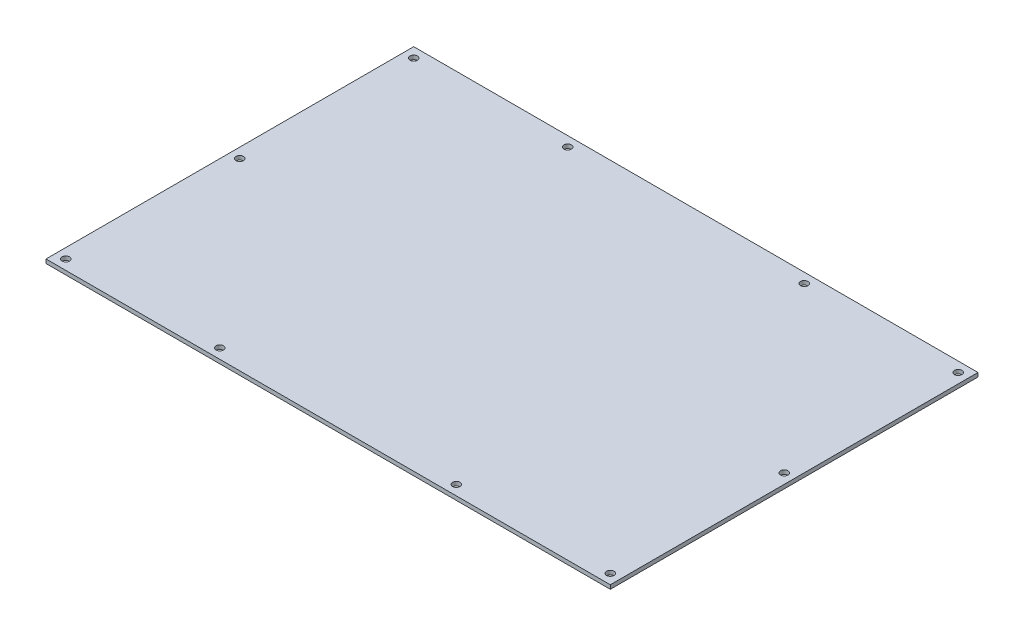
ISO-10303-21;
HEADER;
FILE_DESCRIPTION(('STEP AP214'),'2;1');
FILE_NAME('part.step','',(''),(''),'','','');
FILE_SCHEMA(('AUTOMOTIVE_DESIGN { 1 0 10303 214 1 1 1 1 }'));
ENDSEC;
DATA;
#1=APPLICATION_CONTEXT('core data for automotive mechanical design processes');
#2=APPLICATION_PROTOCOL_DEFINITION('international standard','automotive_design',2000,#1);
#3=PRODUCT_CONTEXT('',#1,'mechanical');
#4=PRODUCT('Part','Part','',(#3));
#5=PRODUCT_RELATED_PRODUCT_CATEGORY('part','',(#4));
#6=PRODUCT_DEFINITION_FORMATION('','',#4);
#7=PRODUCT_DEFINITION_CONTEXT('part definition',#1,'design');
#8=PRODUCT_DEFINITION('design','',#6,#7);
#9=PRODUCT_DEFINITION_SHAPE('','',#8);
#10=(LENGTH_UNIT() NAMED_UNIT(*) SI_UNIT(.MILLI.,.METRE.));
#11=(NAMED_UNIT(*) PLANE_ANGLE_UNIT() SI_UNIT($,.RADIAN.));
#12=(NAMED_UNIT(*) SI_UNIT($,.STERADIAN.) SOLID_ANGLE_UNIT());
#13=UNCERTAINTY_MEASURE_WITH_UNIT(LENGTH_MEASURE(1.E-05),#10,'distance_accuracy_value','');
#14=(GEOMETRIC_REPRESENTATION_CONTEXT(3) GLOBAL_UNCERTAINTY_ASSIGNED_CONTEXT((#13)) GLOBAL_UNIT_ASSIGNED_CONTEXT((#10,
#11,#12)) REPRESENTATION_CONTEXT('',''));
#15=CARTESIAN_POINT('',(0.,0.,0.));
#16=DIRECTION('',(0.,0.,1.));
#17=DIRECTION('',(1.,0.,0.));
#18=AXIS2_PLACEMENT_3D('',#15,#16,#17);
#19=CARTESIAN_POINT('',(227.86,1.6,-1.8200124517479E-13));
#20=DIRECTION('',(0.,-1.,0.));
#21=DIRECTION('',(0.,0.,-1.));
#22=AXIS2_PLACEMENT_3D('',#19,#20,#21);
#23=PLANE('',#22);
#24=CARTESIAN_POINT('',(3.99999999999996,1.6,-144.48));
#25=DIRECTION('',(0.,1.,0.));
#26=DIRECTION('',(0.,0.,1.));
#27=AXIS2_PLACEMENT_3D('',#24,#25,#26);
#28=CIRCLE('',#27,1.49999999999999);
#29=CARTESIAN_POINT('',(3.99999999999996,1.6,-142.98));
#30=VERTEX_POINT('',#29);
#31=EDGE_CURVE('E157',#30,#30,#28,.T.);
#32=ORIENTED_EDGE('',*,*,#31,.F.);
#33=EDGE_LOOP('',(#32));
#34=FACE_BOUND('',#33,.T.);
#35=CARTESIAN_POINT('',(223.86,1.6,-4.00000000000023));
#36=DIRECTION('',(0.,1.,0.));
#37=DIRECTION('',(0.,0.,1.));
#38=AXIS2_PLACEMENT_3D('',#35,#36,#37);
#39=CIRCLE('',#38,1.50000000000008);
#40=CARTESIAN_POINT('',(223.86,1.6,-2.50000000000014));
#41=VERTEX_POINT('',#40);
#42=EDGE_CURVE('E145',#41,#41,#39,.T.);
#43=ORIENTED_EDGE('',*,*,#42,.F.);
#44=EDGE_LOOP('',(#43));
#45=FACE_BOUND('',#44,.T.);
#46=CARTESIAN_POINT('',(161.68,1.6,-144.48));
#47=DIRECTION('',(0.,1.,0.));
#48=DIRECTION('',(0.,0.,1.));
#49=AXIS2_PLACEMENT_3D('',#46,#47,#48);
#50=CIRCLE('',#49,1.50000000000002);
#51=CARTESIAN_POINT('',(161.68,1.6,-142.98));
#52=VERTEX_POINT('',#51);
#53=EDGE_CURVE('E133',#52,#52,#50,.T.);
#54=ORIENTED_EDGE('',*,*,#53,.F.);
#55=EDGE_LOOP('',(#54));
#56=FACE_BOUND('',#55,.T.);
#57=CARTESIAN_POINT('',(66.18,1.6,-4.00000000000023));
#58=DIRECTION('',(0.,1.,0.));
#59=DIRECTION('',(0.,0.,1.));
#60=AXIS2_PLACEMENT_3D('',#57,#58,#59);
#61=CIRCLE('',#60,1.50000000000003);
#62=CARTESIAN_POINT('',(66.18,1.6,-2.5000000000002));
#63=VERTEX_POINT('',#62);
#64=EDGE_CURVE('E121',#63,#63,#61,.T.);
#65=ORIENTED_EDGE('',*,*,#64,.F.);
#66=EDGE_LOOP('',(#65));
#67=FACE_BOUND('',#66,.T.);
#68=CARTESIAN_POINT('',(223.86,1.6,-74.2400000000002));
#69=DIRECTION('',(0.,1.,0.));
#70=DIRECTION('',(0.,0.,1.));
#71=AXIS2_PLACEMENT_3D('',#68,#69,#70);
#72=CIRCLE('',#71,1.50000000000009);
#73=CARTESIAN_POINT('',(223.86,1.6,-72.7400000000001));
#74=VERTEX_POINT('',#73);
#75=EDGE_CURVE('E100',#74,#74,#72,.T.);
#76=ORIENTED_EDGE('',*,*,#75,.F.);
#77=EDGE_LOOP('',(#76));
#78=FACE_BOUND('',#77,.T.);
#79=DIRECTION('',(0.,0.,-1.));
#80=VECTOR('',#79,1.);
#81=CARTESIAN_POINT('',(227.86,1.6,-148.48));
#82=LINE('',#81,#80);
#83=CARTESIAN_POINT('',(227.86,1.6,-1.8200124517479E-13));
#84=VERTEX_POINT('',#83);
#85=CARTESIAN_POINT('',(227.86,1.6,-148.48));
#86=VERTEX_POINT('',#85);
#87=EDGE_CURVE('E85',#84,#86,#82,.T.);
#88=ORIENTED_EDGE('',*,*,#87,.T.);
#89=DIRECTION('',(-1.,0.,0.));
#90=VECTOR('',#89,1.);
#91=CARTESIAN_POINT('',(227.86,1.6,-148.48));
#92=LINE('',#91,#90);
#93=CARTESIAN_POINT('',(0.,1.6,-148.48));
#94=VERTEX_POINT('',#93);
#95=EDGE_CURVE('E80',#86,#94,#92,.T.);
#96=ORIENTED_EDGE('',*,*,#95,.T.);
#97=DIRECTION('',(0.,0.,1.));
#98=VECTOR('',#97,1.);
#99=CARTESIAN_POINT('',(0.,1.6,0.));
#100=LINE('',#99,#98);
#101=CARTESIAN_POINT('',(0.,1.6,0.));
#102=VERTEX_POINT('',#101);
#103=EDGE_CURVE('E83',#94,#102,#100,.T.);
#104=ORIENTED_EDGE('',*,*,#103,.T.);
#105=DIRECTION('',(1.,0.,0.));
#106=VECTOR('',#105,1.);
#107=CARTESIAN_POINT('',(227.86,1.6,-1.8200124517479E-13));
#108=LINE('',#107,#106);
#109=EDGE_CURVE('E50',#102,#84,#108,.T.);
#110=ORIENTED_EDGE('',*,*,#109,.T.);
#111=EDGE_LOOP('',(#88,#96,#104,#110));
#112=FACE_BOUND('',#111,.T.);
#113=CARTESIAN_POINT('',(3.99999999999997,1.6,-74.2400000000002));
#114=DIRECTION('',(0.,1.,0.));
#115=DIRECTION('',(0.,0.,-1.));
#116=AXIS2_PLACEMENT_3D('',#113,#114,#115);
#117=CIRCLE('',#116,1.49999999999996);
#118=CARTESIAN_POINT('',(3.99999999999997,1.6,-75.7400000000002));
#119=VERTEX_POINT('',#118);
#120=EDGE_CURVE('E115',#119,#119,#117,.T.);
#121=ORIENTED_EDGE('',*,*,#120,.F.);
#122=EDGE_LOOP('',(#121));
#123=FACE_BOUND('',#122,.T.);
#124=CARTESIAN_POINT('',(161.68,1.6,-4.00000000000023));
#125=DIRECTION('',(0.,1.,0.));
#126=DIRECTION('',(0.,0.,1.));
#127=AXIS2_PLACEMENT_3D('',#124,#125,#126);
#128=CIRCLE('',#127,1.50000000000003);
#129=CARTESIAN_POINT('',(161.68,1.6,-2.5000000000002));
#130=VERTEX_POINT('',#129);
#131=EDGE_CURVE('E127',#130,#130,#128,.T.);
#132=ORIENTED_EDGE('',*,*,#131,.F.);
#133=EDGE_LOOP('',(#132));
#134=FACE_BOUND('',#133,.T.);
#135=CARTESIAN_POINT('',(66.18,1.6,-144.48));
#136=DIRECTION('',(0.,1.,0.));
#137=DIRECTION('',(0.,0.,1.));
#138=AXIS2_PLACEMENT_3D('',#135,#136,#137);
#139=CIRCLE('',#138,1.50000000000002);
#140=CARTESIAN_POINT('',(66.18,1.6,-142.98));
#141=VERTEX_POINT('',#140);
#142=EDGE_CURVE('E139',#141,#141,#139,.T.);
#143=ORIENTED_EDGE('',*,*,#142,.F.);
#144=EDGE_LOOP('',(#143));
#145=FACE_BOUND('',#144,.T.);
#146=CARTESIAN_POINT('',(3.99999999999998,1.6,-4.00000000000023));
#147=DIRECTION('',(0.,1.,0.));
#148=DIRECTION('',(0.,0.,-1.));
#149=AXIS2_PLACEMENT_3D('',#146,#147,#148);
#150=CIRCLE('',#149,1.49999999999997);
#151=CARTESIAN_POINT('',(3.99999999999998,1.6,-5.5000000000002));
#152=VERTEX_POINT('',#151);
#153=EDGE_CURVE('E151',#152,#152,#150,.T.);
#154=ORIENTED_EDGE('',*,*,#153,.F.);
#155=EDGE_LOOP('',(#154));
#156=FACE_BOUND('',#155,.T.);
#157=CARTESIAN_POINT('',(223.86,1.6,-144.48));
#158=DIRECTION('',(0.,1.,0.));
#159=DIRECTION('',(0.,0.,-1.));
#160=AXIS2_PLACEMENT_3D('',#157,#158,#159);
#161=CIRCLE('',#160,1.50000000000009);
#162=CARTESIAN_POINT('',(223.86,1.6,-145.98));
#163=VERTEX_POINT('',#162);
#164=EDGE_CURVE('E163',#163,#163,#161,.T.);
#165=ORIENTED_EDGE('',*,*,#164,.F.);
#166=EDGE_LOOP('',(#165));
#167=FACE_BOUND('',#166,.T.);
#168=ADVANCED_FACE('F33',(#34,#45,#56,#67,#78,#112,#123,#134,#145,#156,#167),#23,.F.);
#169=CARTESIAN_POINT('',(227.86,0.,-1.8200124517479E-13));
#170=DIRECTION('',(0.,-1.,0.));
#171=DIRECTION('',(0.,0.,-1.));
#172=AXIS2_PLACEMENT_3D('',#169,#170,#171);
#173=PLANE('',#172);
#174=CARTESIAN_POINT('',(3.99999999999996,0.,-144.48));
#175=DIRECTION('',(0.,1.,0.));
#176=DIRECTION('',(0.,0.,1.));
#177=AXIS2_PLACEMENT_3D('',#174,#175,#176);
#178=CIRCLE('',#177,1.49999999999999);
#179=CARTESIAN_POINT('',(3.99999999999996,0.,-142.98));
#180=VERTEX_POINT('',#179);
#181=EDGE_CURVE('E160',#180,#180,#178,.T.);
#182=ORIENTED_EDGE('',*,*,#181,.T.);
#183=EDGE_LOOP('',(#182));
#184=FACE_BOUND('',#183,.T.);
#185=CARTESIAN_POINT('',(223.86,0.,-4.00000000000023));
#186=DIRECTION('',(0.,1.,0.));
#187=DIRECTION('',(0.,0.,1.));
#188=AXIS2_PLACEMENT_3D('',#185,#186,#187);
#189=CIRCLE('',#188,1.50000000000008);
#190=CARTESIAN_POINT('',(223.86,0.,-2.50000000000014));
#191=VERTEX_POINT('',#190);
#192=EDGE_CURVE('E148',#191,#191,#189,.T.);
#193=ORIENTED_EDGE('',*,*,#192,.T.);
#194=EDGE_LOOP('',(#193));
#195=FACE_BOUND('',#194,.T.);
#196=CARTESIAN_POINT('',(161.68,0.,-144.48));
#197=DIRECTION('',(0.,1.,0.));
#198=DIRECTION('',(0.,0.,1.));
#199=AXIS2_PLACEMENT_3D('',#196,#197,#198);
#200=CIRCLE('',#199,1.50000000000002);
#201=CARTESIAN_POINT('',(161.68,0.,-142.98));
#202=VERTEX_POINT('',#201);
#203=EDGE_CURVE('E136',#202,#202,#200,.T.);
#204=ORIENTED_EDGE('',*,*,#203,.T.);
#205=EDGE_LOOP('',(#204));
#206=FACE_BOUND('',#205,.T.);
#207=CARTESIAN_POINT('',(66.18,0.,-4.00000000000023));
#208=DIRECTION('',(0.,1.,0.));
#209=DIRECTION('',(0.,0.,1.));
#210=AXIS2_PLACEMENT_3D('',#207,#208,#209);
#211=CIRCLE('',#210,1.50000000000003);
#212=CARTESIAN_POINT('',(66.18,0.,-2.5000000000002));
#213=VERTEX_POINT('',#212);
#214=EDGE_CURVE('E124',#213,#213,#211,.T.);
#215=ORIENTED_EDGE('',*,*,#214,.T.);
#216=EDGE_LOOP('',(#215));
#217=FACE_BOUND('',#216,.T.);
#218=CARTESIAN_POINT('',(223.86,0.,-74.2400000000002));
#219=DIRECTION('',(0.,1.,0.));
#220=DIRECTION('',(0.,0.,1.));
#221=AXIS2_PLACEMENT_3D('',#218,#219,#220);
#222=CIRCLE('',#221,1.50000000000009);
#223=CARTESIAN_POINT('',(223.86,0.,-72.7400000000001));
#224=VERTEX_POINT('',#223);
#225=EDGE_CURVE('E112',#224,#224,#222,.T.);
#226=ORIENTED_EDGE('',*,*,#225,.T.);
#227=EDGE_LOOP('',(#226));
#228=FACE_BOUND('',#227,.T.);
#229=DIRECTION('',(0.,0.,-1.));
#230=VECTOR('',#229,1.);
#231=CARTESIAN_POINT('',(227.86,0.,-148.48));
#232=LINE('',#231,#230);
#233=CARTESIAN_POINT('',(227.86,0.,-1.8200124517479E-13));
#234=VERTEX_POINT('',#233);
#235=CARTESIAN_POINT('',(227.86,0.,-148.48));
#236=VERTEX_POINT('',#235);
#237=EDGE_CURVE('E97',#234,#236,#232,.T.);
#238=ORIENTED_EDGE('',*,*,#237,.F.);
#239=DIRECTION('',(1.,0.,0.));
#240=VECTOR('',#239,1.);
#241=CARTESIAN_POINT('',(227.86,0.,-1.8200124517479E-13));
#242=LINE('',#241,#240);
#243=CARTESIAN_POINT('',(0.,0.,0.));
#244=VERTEX_POINT('',#243);
#245=EDGE_CURVE('E73',#244,#234,#242,.T.);
#246=ORIENTED_EDGE('',*,*,#245,.F.);
#247=DIRECTION('',(0.,0.,1.));
#248=VECTOR('',#247,1.);
#249=CARTESIAN_POINT('',(0.,0.,0.));
#250=LINE('',#249,#248);
#251=CARTESIAN_POINT('',(0.,0.,-148.48));
#252=VERTEX_POINT('',#251);
#253=EDGE_CURVE('E67',#252,#244,#250,.T.);
#254=ORIENTED_EDGE('',*,*,#253,.F.);
#255=DIRECTION('',(-1.,0.,0.));
#256=VECTOR('',#255,1.);
#257=CARTESIAN_POINT('',(227.86,0.,-148.48));
#258=LINE('',#257,#256);
#259=EDGE_CURVE('E89',#236,#252,#258,.T.);
#260=ORIENTED_EDGE('',*,*,#259,.F.);
#261=EDGE_LOOP('',(#238,#246,#254,#260));
#262=FACE_BOUND('',#261,.T.);
#263=CARTESIAN_POINT('',(3.99999999999997,0.,-74.2400000000002));
#264=DIRECTION('',(0.,1.,0.));
#265=DIRECTION('',(0.,0.,-1.));
#266=AXIS2_PLACEMENT_3D('',#263,#264,#265);
#267=CIRCLE('',#266,1.49999999999996);
#268=CARTESIAN_POINT('',(3.99999999999997,0.,-75.7400000000002));
#269=VERTEX_POINT('',#268);
#270=EDGE_CURVE('E118',#269,#269,#267,.T.);
#271=ORIENTED_EDGE('',*,*,#270,.T.);
#272=EDGE_LOOP('',(#271));
#273=FACE_BOUND('',#272,.T.);
#274=CARTESIAN_POINT('',(161.68,0.,-4.00000000000023));
#275=DIRECTION('',(0.,1.,0.));
#276=DIRECTION('',(0.,0.,1.));
#277=AXIS2_PLACEMENT_3D('',#274,#275,#276);
#278=CIRCLE('',#277,1.50000000000003);
#279=CARTESIAN_POINT('',(161.68,0.,-2.5000000000002));
#280=VERTEX_POINT('',#279);
#281=EDGE_CURVE('E130',#280,#280,#278,.T.);
#282=ORIENTED_EDGE('',*,*,#281,.T.);
#283=EDGE_LOOP('',(#282));
#284=FACE_BOUND('',#283,.T.);
#285=CARTESIAN_POINT('',(66.18,0.,-144.48));
#286=DIRECTION('',(0.,1.,0.));
#287=DIRECTION('',(0.,0.,1.));
#288=AXIS2_PLACEMENT_3D('',#285,#286,#287);
#289=CIRCLE('',#288,1.50000000000002);
#290=CARTESIAN_POINT('',(66.18,0.,-142.98));
#291=VERTEX_POINT('',#290);
#292=EDGE_CURVE('E142',#291,#291,#289,.T.);
#293=ORIENTED_EDGE('',*,*,#292,.T.);
#294=EDGE_LOOP('',(#293));
#295=FACE_BOUND('',#294,.T.);
#296=CARTESIAN_POINT('',(3.99999999999998,0.,-4.00000000000023));
#297=DIRECTION('',(0.,1.,0.));
#298=DIRECTION('',(0.,0.,-1.));
#299=AXIS2_PLACEMENT_3D('',#296,#297,#298);
#300=CIRCLE('',#299,1.49999999999997);
#301=CARTESIAN_POINT('',(3.99999999999998,0.,-5.5000000000002));
#302=VERTEX_POINT('',#301);
#303=EDGE_CURVE('E154',#302,#302,#300,.T.);
#304=ORIENTED_EDGE('',*,*,#303,.T.);
#305=EDGE_LOOP('',(#304));
#306=FACE_BOUND('',#305,.T.);
#307=CARTESIAN_POINT('',(223.86,0.,-144.48));
#308=DIRECTION('',(0.,1.,0.));
#309=DIRECTION('',(0.,0.,-1.));
#310=AXIS2_PLACEMENT_3D('',#307,#308,#309);
#311=CIRCLE('',#310,1.50000000000009);
#312=CARTESIAN_POINT('',(223.86,0.,-145.98));
#313=VERTEX_POINT('',#312);
#314=EDGE_CURVE('E166',#313,#313,#311,.T.);
#315=ORIENTED_EDGE('',*,*,#314,.T.);
#316=EDGE_LOOP('',(#315));
#317=FACE_BOUND('',#316,.T.);
#318=ADVANCED_FACE('F108',(#184,#195,#206,#217,#228,#262,#273,#284,#295,#306,#317),#173,.T.);
#319=CARTESIAN_POINT('',(227.86,1.6,-148.48));
#320=DIRECTION('',(-1.,0.,0.));
#321=DIRECTION('',(0.,0.,1.));
#322=AXIS2_PLACEMENT_3D('',#319,#320,#321);
#323=PLANE('',#322);
#324=ORIENTED_EDGE('',*,*,#237,.T.);
#325=DIRECTION('',(0.,-1.,0.));
#326=VECTOR('',#325,1.);
#327=CARTESIAN_POINT('',(227.86,1.6,-148.48));
#328=LINE('',#327,#326);
#329=EDGE_CURVE('E11',#86,#236,#328,.T.);
#330=ORIENTED_EDGE('',*,*,#329,.F.);
#331=ORIENTED_EDGE('',*,*,#87,.F.);
#332=DIRECTION('',(0.,-1.,0.));
#333=VECTOR('',#332,1.);
#334=CARTESIAN_POINT('',(227.86,1.6,-1.8200124517479E-13));
#335=LINE('',#334,#333);
#336=EDGE_CURVE('E93',#84,#234,#335,.T.);
#337=ORIENTED_EDGE('',*,*,#336,.T.);
#338=EDGE_LOOP('',(#324,#330,#331,#337));
#339=FACE_BOUND('',#338,.T.);
#340=ADVANCED_FACE('F35',(#339),#323,.F.);
#341=CARTESIAN_POINT('',(227.86,1.6,-148.48));
#342=DIRECTION('',(0.,0.,1.));
#343=DIRECTION('',(1.,0.,0.));
#344=AXIS2_PLACEMENT_3D('',#341,#342,#343);
#345=PLANE('',#344);
#346=ORIENTED_EDGE('',*,*,#259,.T.);
#347=DIRECTION('',(0.,-1.,0.));
#348=VECTOR('',#347,1.);
#349=CARTESIAN_POINT('',(0.,1.6,-148.48));
#350=LINE('',#349,#348);
#351=EDGE_CURVE('E42',#94,#252,#350,.T.);
#352=ORIENTED_EDGE('',*,*,#351,.F.);
#353=ORIENTED_EDGE('',*,*,#95,.F.);
#354=ORIENTED_EDGE('',*,*,#329,.T.);
#355=EDGE_LOOP('',(#346,#352,#353,#354));
#356=FACE_BOUND('',#355,.T.);
#357=ADVANCED_FACE('F88',(#356),#345,.F.);
#358=CARTESIAN_POINT('',(0.,1.6,0.));
#359=DIRECTION('',(1.,0.,0.));
#360=DIRECTION('',(0.,0.,-1.));
#361=AXIS2_PLACEMENT_3D('',#358,#359,#360);
#362=PLANE('',#361);
#363=ORIENTED_EDGE('',*,*,#253,.T.);
#364=DIRECTION('',(0.,-1.,0.));
#365=VECTOR('',#364,1.);
#366=CARTESIAN_POINT('',(0.,1.6,0.));
#367=LINE('',#366,#365);
#368=EDGE_CURVE('E90',#102,#244,#367,.T.);
#369=ORIENTED_EDGE('',*,*,#368,.F.);
#370=ORIENTED_EDGE('',*,*,#103,.F.);
#371=ORIENTED_EDGE('',*,*,#351,.T.);
#372=EDGE_LOOP('',(#363,#369,#370,#371));
#373=FACE_BOUND('',#372,.T.);
#374=ADVANCED_FACE('F91',(#373),#362,.F.);
#375=CARTESIAN_POINT('',(227.86,1.6,-1.8200124517479E-13));
#376=DIRECTION('',(0.,0.,-1.));
#377=DIRECTION('',(-1.,0.,0.));
#378=AXIS2_PLACEMENT_3D('',#375,#376,#377);
#379=PLANE('',#378);
#380=ORIENTED_EDGE('',*,*,#245,.T.);
#381=ORIENTED_EDGE('',*,*,#336,.F.);
#382=ORIENTED_EDGE('',*,*,#109,.F.);
#383=ORIENTED_EDGE('',*,*,#368,.T.);
#384=EDGE_LOOP('',(#380,#381,#382,#383));
#385=FACE_BOUND('',#384,.T.);
#386=ADVANCED_FACE('F105',(#385),#379,.F.);
#387=CARTESIAN_POINT('',(223.86,1.6,-74.2400000000002));
#388=DIRECTION('',(0.,-1.,0.));
#389=DIRECTION('',(0.,0.,-1.));
#390=AXIS2_PLACEMENT_3D('',#387,#388,#389);
#391=CYLINDRICAL_SURFACE('',#390,1.50000000000009);
#392=ORIENTED_EDGE('',*,*,#75,.T.);
#393=EDGE_LOOP('',(#392));
#394=FACE_BOUND('',#393,.T.);
#395=ORIENTED_EDGE('',*,*,#225,.F.);
#396=EDGE_LOOP('',(#395));
#397=FACE_BOUND('',#396,.T.);
#398=ADVANCED_FACE('F186',(#394,#397),#391,.F.);
#399=CARTESIAN_POINT('',(3.99999999999997,1.6,-74.2400000000002));
#400=DIRECTION('',(0.,-1.,0.));
#401=DIRECTION('',(0.,0.,-1.));
#402=AXIS2_PLACEMENT_3D('',#399,#400,#401);
#403=CYLINDRICAL_SURFACE('',#402,1.49999999999996);
#404=ORIENTED_EDGE('',*,*,#120,.T.);
#405=EDGE_LOOP('',(#404));
#406=FACE_BOUND('',#405,.T.);
#407=ORIENTED_EDGE('',*,*,#270,.F.);
#408=EDGE_LOOP('',(#407));
#409=FACE_BOUND('',#408,.T.);
#410=ADVANCED_FACE('F232',(#406,#409),#403,.F.);
#411=CARTESIAN_POINT('',(66.18,1.6,-4.00000000000023));
#412=DIRECTION('',(0.,-1.,0.));
#413=DIRECTION('',(0.,0.,-1.));
#414=AXIS2_PLACEMENT_3D('',#411,#412,#413);
#415=CYLINDRICAL_SURFACE('',#414,1.50000000000003);
#416=ORIENTED_EDGE('',*,*,#64,.T.);
#417=EDGE_LOOP('',(#416));
#418=FACE_BOUND('',#417,.T.);
#419=ORIENTED_EDGE('',*,*,#214,.F.);
#420=EDGE_LOOP('',(#419));
#421=FACE_BOUND('',#420,.T.);
#422=ADVANCED_FACE('F240',(#418,#421),#415,.F.);
#423=CARTESIAN_POINT('',(161.68,1.6,-4.00000000000023));
#424=DIRECTION('',(0.,-1.,0.));
#425=DIRECTION('',(0.,0.,-1.));
#426=AXIS2_PLACEMENT_3D('',#423,#424,#425);
#427=CYLINDRICAL_SURFACE('',#426,1.50000000000003);
#428=ORIENTED_EDGE('',*,*,#131,.T.);
#429=EDGE_LOOP('',(#428));
#430=FACE_BOUND('',#429,.T.);
#431=ORIENTED_EDGE('',*,*,#281,.F.);
#432=EDGE_LOOP('',(#431));
#433=FACE_BOUND('',#432,.T.);
#434=ADVANCED_FACE('F248',(#430,#433),#427,.F.);
#435=CARTESIAN_POINT('',(161.68,1.6,-144.48));
#436=DIRECTION('',(0.,-1.,0.));
#437=DIRECTION('',(0.,0.,-1.));
#438=AXIS2_PLACEMENT_3D('',#435,#436,#437);
#439=CYLINDRICAL_SURFACE('',#438,1.50000000000002);
#440=ORIENTED_EDGE('',*,*,#53,.T.);
#441=EDGE_LOOP('',(#440));
#442=FACE_BOUND('',#441,.T.);
#443=ORIENTED_EDGE('',*,*,#203,.F.);
#444=EDGE_LOOP('',(#443));
#445=FACE_BOUND('',#444,.T.);
#446=ADVANCED_FACE('F257',(#442,#445),#439,.F.);
#447=CARTESIAN_POINT('',(66.18,1.6,-144.48));
#448=DIRECTION('',(0.,-1.,0.));
#449=DIRECTION('',(0.,0.,-1.));
#450=AXIS2_PLACEMENT_3D('',#447,#448,#449);
#451=CYLINDRICAL_SURFACE('',#450,1.50000000000002);
#452=ORIENTED_EDGE('',*,*,#142,.T.);
#453=EDGE_LOOP('',(#452));
#454=FACE_BOUND('',#453,.T.);
#455=ORIENTED_EDGE('',*,*,#292,.F.);
#456=EDGE_LOOP('',(#455));
#457=FACE_BOUND('',#456,.T.);
#458=ADVANCED_FACE('F266',(#454,#457),#451,.F.);
#459=CARTESIAN_POINT('',(223.86,1.6,-4.00000000000023));
#460=DIRECTION('',(0.,-1.,0.));
#461=DIRECTION('',(0.,0.,-1.));
#462=AXIS2_PLACEMENT_3D('',#459,#460,#461);
#463=CYLINDRICAL_SURFACE('',#462,1.50000000000008);
#464=ORIENTED_EDGE('',*,*,#42,.T.);
#465=EDGE_LOOP('',(#464));
#466=FACE_BOUND('',#465,.T.);
#467=ORIENTED_EDGE('',*,*,#192,.F.);
#468=EDGE_LOOP('',(#467));
#469=FACE_BOUND('',#468,.T.);
#470=ADVANCED_FACE('F275',(#466,#469),#463,.F.);
#471=CARTESIAN_POINT('',(3.99999999999998,1.6,-4.00000000000023));
#472=DIRECTION('',(0.,-1.,0.));
#473=DIRECTION('',(0.,0.,-1.));
#474=AXIS2_PLACEMENT_3D('',#471,#472,#473);
#475=CYLINDRICAL_SURFACE('',#474,1.49999999999997);
#476=ORIENTED_EDGE('',*,*,#153,.T.);
#477=EDGE_LOOP('',(#476));
#478=FACE_BOUND('',#477,.T.);
#479=ORIENTED_EDGE('',*,*,#303,.F.);
#480=EDGE_LOOP('',(#479));
#481=FACE_BOUND('',#480,.T.);
#482=ADVANCED_FACE('F284',(#478,#481),#475,.F.);
#483=CARTESIAN_POINT('',(3.99999999999996,1.6,-144.48));
#484=DIRECTION('',(0.,-1.,0.));
#485=DIRECTION('',(0.,0.,-1.));
#486=AXIS2_PLACEMENT_3D('',#483,#484,#485);
#487=CYLINDRICAL_SURFACE('',#486,1.49999999999999);
#488=ORIENTED_EDGE('',*,*,#31,.T.);
#489=EDGE_LOOP('',(#488));
#490=FACE_BOUND('',#489,.T.);
#491=ORIENTED_EDGE('',*,*,#181,.F.);
#492=EDGE_LOOP('',(#491));
#493=FACE_BOUND('',#492,.T.);
#494=ADVANCED_FACE('F293',(#490,#493),#487,.F.);
#495=CARTESIAN_POINT('',(223.86,1.6,-144.48));
#496=DIRECTION('',(0.,-1.,0.));
#497=DIRECTION('',(0.,0.,-1.));
#498=AXIS2_PLACEMENT_3D('',#495,#496,#497);
#499=CYLINDRICAL_SURFACE('',#498,1.50000000000009);
#500=ORIENTED_EDGE('',*,*,#164,.T.);
#501=EDGE_LOOP('',(#500));
#502=FACE_BOUND('',#501,.T.);
#503=ORIENTED_EDGE('',*,*,#314,.F.);
#504=EDGE_LOOP('',(#503));
#505=FACE_BOUND('',#504,.T.);
#506=ADVANCED_FACE('F172',(#502,#505),#499,.F.);
#507=CLOSED_SHELL('',(#168,#318,#340,#357,#374,#386,#398,#410,#422,#434,#446,#458,#470,#482,
#494,#506));
#508=MANIFOLD_SOLID_BREP('B2',#507);
#509=ADVANCED_BREP_SHAPE_REPRESENTATION('',(#18,#508),#14);
#510=SHAPE_DEFINITION_REPRESENTATION(#9,#509);
ENDSEC;
END-ISO-10303-21;
